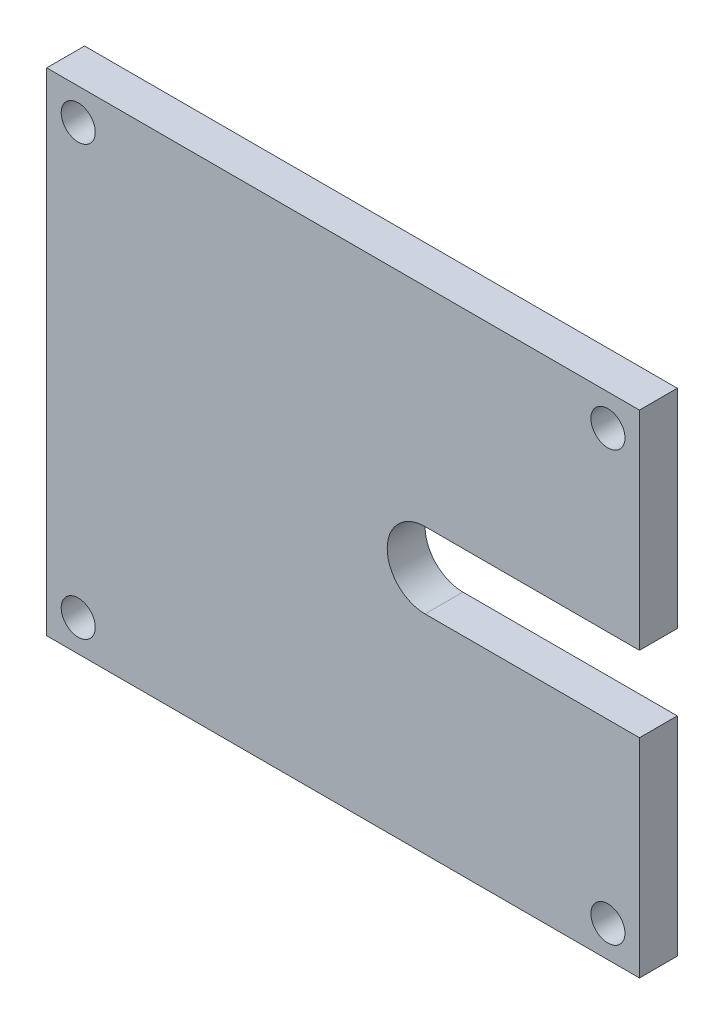
ISO-10303-21;
HEADER;
FILE_DESCRIPTION(('STEP AP214'),'2;1');
FILE_NAME('part.step','',(''),(''),'','','');
FILE_SCHEMA(('AUTOMOTIVE_DESIGN { 1 0 10303 214 1 1 1 1 }'));
ENDSEC;
DATA;
#1=APPLICATION_CONTEXT('core data for automotive mechanical design processes');
#2=APPLICATION_PROTOCOL_DEFINITION('international standard','automotive_design',2000,#1);
#3=PRODUCT_CONTEXT('',#1,'mechanical');
#4=PRODUCT('Part','Part','',(#3));
#5=PRODUCT_RELATED_PRODUCT_CATEGORY('part','',(#4));
#6=PRODUCT_DEFINITION_FORMATION('','',#4);
#7=PRODUCT_DEFINITION_CONTEXT('part definition',#1,'design');
#8=PRODUCT_DEFINITION('design','',#6,#7);
#9=PRODUCT_DEFINITION_SHAPE('','',#8);
#10=(LENGTH_UNIT() NAMED_UNIT(*) SI_UNIT(.MILLI.,.METRE.));
#11=(NAMED_UNIT(*) PLANE_ANGLE_UNIT() SI_UNIT($,.RADIAN.));
#12=(NAMED_UNIT(*) SI_UNIT($,.STERADIAN.) SOLID_ANGLE_UNIT());
#13=UNCERTAINTY_MEASURE_WITH_UNIT(LENGTH_MEASURE(1.E-05),#10,'distance_accuracy_value','');
#14=(GEOMETRIC_REPRESENTATION_CONTEXT(3) GLOBAL_UNCERTAINTY_ASSIGNED_CONTEXT((#13)) GLOBAL_UNIT_ASSIGNED_CONTEXT((#10,
#11,#12)) REPRESENTATION_CONTEXT('',''));
#15=CARTESIAN_POINT('',(0.,0.,0.));
#16=DIRECTION('',(0.,0.,1.));
#17=DIRECTION('',(1.,0.,0.));
#18=AXIS2_PLACEMENT_3D('',#15,#16,#17);
#19=CARTESIAN_POINT('',(23.5,-19.5,3.));
#20=DIRECTION('',(-1.,0.,0.));
#21=DIRECTION('',(0.,0.,1.));
#22=AXIS2_PLACEMENT_3D('',#19,#20,#21);
#23=PLANE('',#22);
#24=DIRECTION('',(0.,1.,0.));
#25=VECTOR('',#24,1.);
#26=CARTESIAN_POINT('',(23.5,-19.5,3.));
#27=LINE('',#26,#25);
#28=CARTESIAN_POINT('',(23.5,3.,3.));
#29=VERTEX_POINT('',#28);
#30=CARTESIAN_POINT('',(23.5,19.5,3.));
#31=VERTEX_POINT('',#30);
#32=EDGE_CURVE('E96',#29,#31,#27,.T.);
#33=ORIENTED_EDGE('',*,*,#32,.F.);
#34=DIRECTION('',(0.,0.,1.));
#35=VECTOR('',#34,1.);
#36=CARTESIAN_POINT('',(23.5,3.,-0.001000000000001));
#37=LINE('',#36,#35);
#38=CARTESIAN_POINT('',(23.5,3.,0.));
#39=VERTEX_POINT('',#38);
#40=EDGE_CURVE('E139',#39,#29,#37,.T.);
#41=ORIENTED_EDGE('',*,*,#40,.F.);
#42=DIRECTION('',(0.,1.,0.));
#43=VECTOR('',#42,1.);
#44=CARTESIAN_POINT('',(23.5,-19.5,0.));
#45=LINE('',#44,#43);
#46=CARTESIAN_POINT('',(23.5,19.5,0.));
#47=VERTEX_POINT('',#46);
#48=EDGE_CURVE('E162',#39,#47,#45,.T.);
#49=ORIENTED_EDGE('',*,*,#48,.T.);
#50=DIRECTION('',(0.,0.,-1.));
#51=VECTOR('',#50,1.);
#52=CARTESIAN_POINT('',(23.5,19.5,3.));
#53=LINE('',#52,#51);
#54=EDGE_CURVE('E11',#31,#47,#53,.T.);
#55=ORIENTED_EDGE('',*,*,#54,.F.);
#56=EDGE_LOOP('',(#33,#41,#49,#55));
#57=FACE_BOUND('',#56,.T.);
#58=ADVANCED_FACE('F40',(#57),#23,.F.);
#59=CARTESIAN_POINT('',(23.5,-19.5,0.));
#60=VERTEX_POINT('',#59);
#61=CARTESIAN_POINT('',(23.5,-3.,0.));
#62=VERTEX_POINT('',#61);
#63=EDGE_CURVE('E137',#60,#62,#45,.T.);
#64=ORIENTED_EDGE('',*,*,#63,.T.);
#65=DIRECTION('',(0.,0.,-1.));
#66=VECTOR('',#65,1.);
#67=CARTESIAN_POINT('',(23.5,-3.,-0.001000000000001));
#68=LINE('',#67,#66);
#69=CARTESIAN_POINT('',(23.5,-3.,3.));
#70=VERTEX_POINT('',#69);
#71=EDGE_CURVE('E57',#70,#62,#68,.T.);
#72=ORIENTED_EDGE('',*,*,#71,.F.);
#73=CARTESIAN_POINT('',(23.5,-19.5,3.));
#74=VERTEX_POINT('',#73);
#75=EDGE_CURVE('E135',#74,#70,#27,.T.);
#76=ORIENTED_EDGE('',*,*,#75,.F.);
#77=DIRECTION('',(0.,0.,-1.));
#78=VECTOR('',#77,1.);
#79=CARTESIAN_POINT('',(23.5,-19.5,3.));
#80=LINE('',#79,#78);
#81=EDGE_CURVE('E158',#74,#60,#80,.T.);
#82=ORIENTED_EDGE('',*,*,#81,.T.);
#83=EDGE_LOOP('',(#64,#72,#76,#82));
#84=FACE_BOUND('',#83,.T.);
#85=ADVANCED_FACE('F42',(#84),#23,.F.);
#86=CARTESIAN_POINT('',(-23.5,19.5,3.));
#87=DIRECTION('',(0.,-1.,0.));
#88=DIRECTION('',(0.,0.,-1.));
#89=AXIS2_PLACEMENT_3D('',#86,#87,#88);
#90=PLANE('',#89);
#91=DIRECTION('',(-1.,0.,0.));
#92=VECTOR('',#91,1.);
#93=CARTESIAN_POINT('',(-23.5,19.5,0.));
#94=LINE('',#93,#92);
#95=CARTESIAN_POINT('',(-23.5,19.5,0.));
#96=VERTEX_POINT('',#95);
#97=EDGE_CURVE('E161',#47,#96,#94,.T.);
#98=ORIENTED_EDGE('',*,*,#97,.T.);
#99=DIRECTION('',(0.,0.,-1.));
#100=VECTOR('',#99,1.);
#101=CARTESIAN_POINT('',(-23.5,19.5,3.));
#102=LINE('',#101,#100);
#103=CARTESIAN_POINT('',(-23.5,19.5,3.));
#104=VERTEX_POINT('',#103);
#105=EDGE_CURVE('E48',#104,#96,#102,.T.);
#106=ORIENTED_EDGE('',*,*,#105,.F.);
#107=DIRECTION('',(-1.,0.,0.));
#108=VECTOR('',#107,1.);
#109=CARTESIAN_POINT('',(-23.5,19.5,3.));
#110=LINE('',#109,#108);
#111=EDGE_CURVE('E143',#31,#104,#110,.T.);
#112=ORIENTED_EDGE('',*,*,#111,.F.);
#113=ORIENTED_EDGE('',*,*,#54,.T.);
#114=EDGE_LOOP('',(#98,#106,#112,#113));
#115=FACE_BOUND('',#114,.T.);
#116=ADVANCED_FACE('F262',(#115),#90,.F.);
#117=CARTESIAN_POINT('',(-23.5,-19.5,3.));
#118=DIRECTION('',(1.,0.,0.));
#119=DIRECTION('',(0.,0.,-1.));
#120=AXIS2_PLACEMENT_3D('',#117,#118,#119);
#121=PLANE('',#120);
#122=DIRECTION('',(0.,-1.,0.));
#123=VECTOR('',#122,1.);
#124=CARTESIAN_POINT('',(-23.5,-19.5,0.));
#125=LINE('',#124,#123);
#126=CARTESIAN_POINT('',(-23.5,-19.5,0.));
#127=VERTEX_POINT('',#126);
#128=EDGE_CURVE('E165',#96,#127,#125,.T.);
#129=ORIENTED_EDGE('',*,*,#128,.T.);
#130=DIRECTION('',(0.,0.,-1.));
#131=VECTOR('',#130,1.);
#132=CARTESIAN_POINT('',(-23.5,-19.5,3.));
#133=LINE('',#132,#131);
#134=CARTESIAN_POINT('',(-23.5,-19.5,3.));
#135=VERTEX_POINT('',#134);
#136=EDGE_CURVE('E172',#135,#127,#133,.T.);
#137=ORIENTED_EDGE('',*,*,#136,.F.);
#138=DIRECTION('',(0.,-1.,0.));
#139=VECTOR('',#138,1.);
#140=CARTESIAN_POINT('',(-23.5,-19.5,3.));
#141=LINE('',#140,#139);
#142=EDGE_CURVE('E148',#104,#135,#141,.T.);
#143=ORIENTED_EDGE('',*,*,#142,.F.);
#144=ORIENTED_EDGE('',*,*,#105,.T.);
#145=EDGE_LOOP('',(#129,#137,#143,#144));
#146=FACE_BOUND('',#145,.T.);
#147=ADVANCED_FACE('F180',(#146),#121,.F.);
#148=CARTESIAN_POINT('',(-23.5,-19.5,3.));
#149=DIRECTION('',(0.,1.,0.));
#150=DIRECTION('',(0.,0.,1.));
#151=AXIS2_PLACEMENT_3D('',#148,#149,#150);
#152=PLANE('',#151);
#153=DIRECTION('',(1.,0.,0.));
#154=VECTOR('',#153,1.);
#155=CARTESIAN_POINT('',(-23.5,-19.5,0.));
#156=LINE('',#155,#154);
#157=EDGE_CURVE('E89',#127,#60,#156,.T.);
#158=ORIENTED_EDGE('',*,*,#157,.T.);
#159=ORIENTED_EDGE('',*,*,#81,.F.);
#160=DIRECTION('',(1.,0.,0.));
#161=VECTOR('',#160,1.);
#162=CARTESIAN_POINT('',(-23.5,-19.5,3.));
#163=LINE('',#162,#161);
#164=EDGE_CURVE('E68',#135,#74,#163,.T.);
#165=ORIENTED_EDGE('',*,*,#164,.F.);
#166=ORIENTED_EDGE('',*,*,#136,.T.);
#167=EDGE_LOOP('',(#158,#159,#165,#166));
#168=FACE_BOUND('',#167,.T.);
#169=ADVANCED_FACE('F269',(#168),#152,.F.);
#170=CARTESIAN_POINT('',(0.,0.,3.));
#171=DIRECTION('',(0.,0.,-1.));
#172=DIRECTION('',(-1.,0.,0.));
#173=AXIS2_PLACEMENT_3D('',#170,#171,#172);
#174=PLANE('',#173);
#175=CARTESIAN_POINT('',(-21.,-17.,3.));
#176=DIRECTION('',(0.,0.,1.));
#177=DIRECTION('',(1.,0.,0.));
#178=AXIS2_PLACEMENT_3D('',#175,#176,#177);
#179=CIRCLE('',#178,1.35);
#180=CARTESIAN_POINT('',(-19.65,-17.,3.));
#181=VERTEX_POINT('',#180);
#182=EDGE_CURVE('E194',#181,#181,#179,.T.);
#183=ORIENTED_EDGE('',*,*,#182,.F.);
#184=EDGE_LOOP('',(#183));
#185=FACE_BOUND('',#184,.T.);
#186=CARTESIAN_POINT('',(21.,17.,3.));
#187=DIRECTION('',(0.,0.,1.));
#188=DIRECTION('',(1.,0.,0.));
#189=AXIS2_PLACEMENT_3D('',#186,#187,#188);
#190=CIRCLE('',#189,1.35);
#191=CARTESIAN_POINT('',(22.35,17.,3.));
#192=VERTEX_POINT('',#191);
#193=EDGE_CURVE('E206',#192,#192,#190,.T.);
#194=ORIENTED_EDGE('',*,*,#193,.F.);
#195=EDGE_LOOP('',(#194));
#196=FACE_BOUND('',#195,.T.);
#197=CARTESIAN_POINT('',(21.,-17.,3.));
#198=DIRECTION('',(0.,0.,1.));
#199=DIRECTION('',(1.,0.,0.));
#200=AXIS2_PLACEMENT_3D('',#197,#198,#199);
#201=CIRCLE('',#200,1.35);
#202=CARTESIAN_POINT('',(22.35,-17.,3.));
#203=VERTEX_POINT('',#202);
#204=EDGE_CURVE('E212',#203,#203,#201,.T.);
#205=ORIENTED_EDGE('',*,*,#204,.F.);
#206=EDGE_LOOP('',(#205));
#207=FACE_BOUND('',#206,.T.);
#208=CARTESIAN_POINT('',(-21.,17.,3.));
#209=DIRECTION('',(0.,0.,1.));
#210=DIRECTION('',(1.,0.,0.));
#211=AXIS2_PLACEMENT_3D('',#208,#209,#210);
#212=CIRCLE('',#211,1.35);
#213=CARTESIAN_POINT('',(-19.65,17.,3.));
#214=VERTEX_POINT('',#213);
#215=EDGE_CURVE('E217',#214,#214,#212,.T.);
#216=ORIENTED_EDGE('',*,*,#215,.F.);
#217=EDGE_LOOP('',(#216));
#218=FACE_BOUND('',#217,.T.);
#219=CARTESIAN_POINT('',(6.5,0.,3.));
#220=DIRECTION('',(0.,0.,1.));
#221=DIRECTION('',(1.,0.,0.));
#222=AXIS2_PLACEMENT_3D('',#219,#220,#221);
#223=CIRCLE('',#222,3.);
#224=CARTESIAN_POINT('',(6.5,3.,3.));
#225=VERTEX_POINT('',#224);
#226=CARTESIAN_POINT('',(6.5,-3.,3.));
#227=VERTEX_POINT('',#226);
#228=EDGE_CURVE('E130',#225,#227,#223,.T.);
#229=ORIENTED_EDGE('',*,*,#228,.F.);
#230=DIRECTION('',(-1.,0.,0.));
#231=VECTOR('',#230,1.);
#232=CARTESIAN_POINT('',(6.5,3.,3.));
#233=LINE('',#232,#231);
#234=EDGE_CURVE('E129',#29,#225,#233,.T.);
#235=ORIENTED_EDGE('',*,*,#234,.F.);
#236=ORIENTED_EDGE('',*,*,#32,.T.);
#237=ORIENTED_EDGE('',*,*,#111,.T.);
#238=ORIENTED_EDGE('',*,*,#142,.T.);
#239=ORIENTED_EDGE('',*,*,#164,.T.);
#240=ORIENTED_EDGE('',*,*,#75,.T.);
#241=DIRECTION('',(1.,0.,0.));
#242=VECTOR('',#241,1.);
#243=CARTESIAN_POINT('',(6.5,-3.,3.));
#244=LINE('',#243,#242);
#245=EDGE_CURVE('E123',#227,#70,#244,.T.);
#246=ORIENTED_EDGE('',*,*,#245,.F.);
#247=EDGE_LOOP('',(#229,#235,#236,#237,#238,#239,#240,#246));
#248=FACE_BOUND('',#247,.T.);
#249=ADVANCED_FACE('F141',(#185,#196,#207,#218,#248),#174,.F.);
#250=CARTESIAN_POINT('',(0.,0.,0.));
#251=DIRECTION('',(0.,0.,-1.));
#252=DIRECTION('',(-1.,0.,0.));
#253=AXIS2_PLACEMENT_3D('',#250,#251,#252);
#254=PLANE('',#253);
#255=DIRECTION('',(-1.,0.,0.));
#256=VECTOR('',#255,1.);
#257=CARTESIAN_POINT('',(6.5,3.,0.));
#258=LINE('',#257,#256);
#259=CARTESIAN_POINT('',(6.5,3.,0.));
#260=VERTEX_POINT('',#259);
#261=EDGE_CURVE('E230',#39,#260,#258,.T.);
#262=ORIENTED_EDGE('',*,*,#261,.T.);
#263=CARTESIAN_POINT('',(6.5,0.,0.));
#264=DIRECTION('',(0.,0.,-1.));
#265=DIRECTION('',(-1.,0.,0.));
#266=AXIS2_PLACEMENT_3D('',#263,#264,#265);
#267=CIRCLE('',#266,3.);
#268=CARTESIAN_POINT('',(6.5,-3.,0.));
#269=VERTEX_POINT('',#268);
#270=EDGE_CURVE('E192',#260,#269,#267,.F.);
#271=ORIENTED_EDGE('',*,*,#270,.T.);
#272=DIRECTION('',(1.,0.,0.));
#273=VECTOR('',#272,1.);
#274=CARTESIAN_POINT('',(6.5,-3.,0.));
#275=LINE('',#274,#273);
#276=EDGE_CURVE('E190',#269,#62,#275,.T.);
#277=ORIENTED_EDGE('',*,*,#276,.T.);
#278=ORIENTED_EDGE('',*,*,#63,.F.);
#279=ORIENTED_EDGE('',*,*,#157,.F.);
#280=ORIENTED_EDGE('',*,*,#128,.F.);
#281=ORIENTED_EDGE('',*,*,#97,.F.);
#282=ORIENTED_EDGE('',*,*,#48,.F.);
#283=EDGE_LOOP('',(#262,#271,#277,#278,#279,#280,#281,#282));
#284=FACE_BOUND('',#283,.T.);
#285=CARTESIAN_POINT('',(-21.,-17.,0.));
#286=DIRECTION('',(0.,0.,-1.));
#287=DIRECTION('',(-1.,0.,0.));
#288=AXIS2_PLACEMENT_3D('',#285,#286,#287);
#289=CIRCLE('',#288,1.35);
#290=CARTESIAN_POINT('',(-22.35,-17.,0.));
#291=VERTEX_POINT('',#290);
#292=EDGE_CURVE('E199',#291,#291,#289,.T.);
#293=ORIENTED_EDGE('',*,*,#292,.F.);
#294=EDGE_LOOP('',(#293));
#295=FACE_BOUND('',#294,.T.);
#296=CARTESIAN_POINT('',(21.,17.,0.));
#297=DIRECTION('',(0.,0.,-1.));
#298=DIRECTION('',(-1.,0.,0.));
#299=AXIS2_PLACEMENT_3D('',#296,#297,#298);
#300=CIRCLE('',#299,1.35);
#301=CARTESIAN_POINT('',(19.65,17.,0.));
#302=VERTEX_POINT('',#301);
#303=EDGE_CURVE('E209',#302,#302,#300,.T.);
#304=ORIENTED_EDGE('',*,*,#303,.F.);
#305=EDGE_LOOP('',(#304));
#306=FACE_BOUND('',#305,.T.);
#307=CARTESIAN_POINT('',(21.,-17.,0.));
#308=DIRECTION('',(0.,0.,-1.));
#309=DIRECTION('',(-1.,0.,0.));
#310=AXIS2_PLACEMENT_3D('',#307,#308,#309);
#311=CIRCLE('',#310,1.35);
#312=CARTESIAN_POINT('',(19.65,-17.,0.));
#313=VERTEX_POINT('',#312);
#314=EDGE_CURVE('E215',#313,#313,#311,.T.);
#315=ORIENTED_EDGE('',*,*,#314,.F.);
#316=EDGE_LOOP('',(#315));
#317=FACE_BOUND('',#316,.T.);
#318=CARTESIAN_POINT('',(-21.,17.,0.));
#319=DIRECTION('',(0.,0.,-1.));
#320=DIRECTION('',(-1.,0.,0.));
#321=AXIS2_PLACEMENT_3D('',#318,#319,#320);
#322=CIRCLE('',#321,1.35);
#323=CARTESIAN_POINT('',(-22.35,17.,0.));
#324=VERTEX_POINT('',#323);
#325=EDGE_CURVE('E152',#324,#324,#322,.T.);
#326=ORIENTED_EDGE('',*,*,#325,.F.);
#327=EDGE_LOOP('',(#326));
#328=FACE_BOUND('',#327,.T.);
#329=ADVANCED_FACE('F186',(#284,#295,#306,#317,#328),#254,.T.);
#330=CARTESIAN_POINT('',(-21.,17.,3.));
#331=DIRECTION('',(0.,0.,1.));
#332=DIRECTION('',(1.,0.,0.));
#333=AXIS2_PLACEMENT_3D('',#330,#331,#332);
#334=CYLINDRICAL_SURFACE('',#333,1.35);
#335=ORIENTED_EDGE('',*,*,#215,.T.);
#336=EDGE_LOOP('',(#335));
#337=FACE_BOUND('',#336,.T.);
#338=ORIENTED_EDGE('',*,*,#325,.T.);
#339=EDGE_LOOP('',(#338));
#340=FACE_BOUND('',#339,.T.);
#341=ADVANCED_FACE('F276',(#337,#340),#334,.F.);
#342=CARTESIAN_POINT('',(21.,-17.,3.));
#343=DIRECTION('',(0.,0.,1.));
#344=DIRECTION('',(1.,0.,0.));
#345=AXIS2_PLACEMENT_3D('',#342,#343,#344);
#346=CYLINDRICAL_SURFACE('',#345,1.35);
#347=ORIENTED_EDGE('',*,*,#204,.T.);
#348=EDGE_LOOP('',(#347));
#349=FACE_BOUND('',#348,.T.);
#350=ORIENTED_EDGE('',*,*,#314,.T.);
#351=EDGE_LOOP('',(#350));
#352=FACE_BOUND('',#351,.T.);
#353=ADVANCED_FACE('F282',(#349,#352),#346,.F.);
#354=CARTESIAN_POINT('',(21.,17.,3.));
#355=DIRECTION('',(0.,0.,1.));
#356=DIRECTION('',(1.,0.,0.));
#357=AXIS2_PLACEMENT_3D('',#354,#355,#356);
#358=CYLINDRICAL_SURFACE('',#357,1.35);
#359=ORIENTED_EDGE('',*,*,#193,.T.);
#360=EDGE_LOOP('',(#359));
#361=FACE_BOUND('',#360,.T.);
#362=ORIENTED_EDGE('',*,*,#303,.T.);
#363=EDGE_LOOP('',(#362));
#364=FACE_BOUND('',#363,.T.);
#365=ADVANCED_FACE('F254',(#361,#364),#358,.F.);
#366=CARTESIAN_POINT('',(-21.,-17.,3.));
#367=DIRECTION('',(0.,0.,1.));
#368=DIRECTION('',(1.,0.,0.));
#369=AXIS2_PLACEMENT_3D('',#366,#367,#368);
#370=CYLINDRICAL_SURFACE('',#369,1.35);
#371=ORIENTED_EDGE('',*,*,#182,.T.);
#372=EDGE_LOOP('',(#371));
#373=FACE_BOUND('',#372,.T.);
#374=ORIENTED_EDGE('',*,*,#292,.T.);
#375=EDGE_LOOP('',(#374));
#376=FACE_BOUND('',#375,.T.);
#377=ADVANCED_FACE('F247',(#373,#376),#370,.F.);
#378=CARTESIAN_POINT('',(6.5,0.,-0.001000000000001));
#379=DIRECTION('',(0.,0.,1.));
#380=DIRECTION('',(1.,0.,0.));
#381=AXIS2_PLACEMENT_3D('',#378,#379,#380);
#382=CYLINDRICAL_SURFACE('',#381,3.);
#383=DIRECTION('',(0.,0.,1.));
#384=VECTOR('',#383,1.);
#385=CARTESIAN_POINT('',(6.5,3.,-0.001000000000001));
#386=LINE('',#385,#384);
#387=EDGE_CURVE('E195',#260,#225,#386,.T.);
#388=ORIENTED_EDGE('',*,*,#387,.T.);
#389=ORIENTED_EDGE('',*,*,#228,.T.);
#390=DIRECTION('',(0.,0.,1.));
#391=VECTOR('',#390,1.);
#392=CARTESIAN_POINT('',(6.5,-3.,-0.001000000000001));
#393=LINE('',#392,#391);
#394=EDGE_CURVE('E125',#269,#227,#393,.T.);
#395=ORIENTED_EDGE('',*,*,#394,.F.);
#396=ORIENTED_EDGE('',*,*,#270,.F.);
#397=EDGE_LOOP('',(#388,#389,#395,#396));
#398=FACE_BOUND('',#397,.T.);
#399=ADVANCED_FACE('F245',(#398),#382,.F.);
#400=CARTESIAN_POINT('',(6.5,3.,-0.001000000000001));
#401=DIRECTION('',(0.,1.,0.));
#402=DIRECTION('',(-1.,0.,0.));
#403=AXIS2_PLACEMENT_3D('',#400,#401,#402);
#404=PLANE('',#403);
#405=ORIENTED_EDGE('',*,*,#40,.T.);
#406=ORIENTED_EDGE('',*,*,#234,.T.);
#407=ORIENTED_EDGE('',*,*,#387,.F.);
#408=ORIENTED_EDGE('',*,*,#261,.F.);
#409=EDGE_LOOP('',(#405,#406,#407,#408));
#410=FACE_BOUND('',#409,.T.);
#411=ADVANCED_FACE('F243',(#410),#404,.F.);
#412=CARTESIAN_POINT('',(6.5,-3.,-0.001000000000001));
#413=DIRECTION('',(0.,-1.,0.));
#414=DIRECTION('',(1.,0.,0.));
#415=AXIS2_PLACEMENT_3D('',#412,#413,#414);
#416=PLANE('',#415);
#417=ORIENTED_EDGE('',*,*,#394,.T.);
#418=ORIENTED_EDGE('',*,*,#245,.T.);
#419=ORIENTED_EDGE('',*,*,#71,.T.);
#420=ORIENTED_EDGE('',*,*,#276,.F.);
#421=EDGE_LOOP('',(#417,#418,#419,#420));
#422=FACE_BOUND('',#421,.T.);
#423=ADVANCED_FACE('F124',(#422),#416,.F.);
#424=CLOSED_SHELL('',(#58,#85,#116,#147,#169,#249,#329,#341,#353,#365,#377,#399,#411,#423));
#425=MANIFOLD_SOLID_BREP('B2',#424);
#426=ADVANCED_BREP_SHAPE_REPRESENTATION('',(#18,#425),#14);
#427=SHAPE_DEFINITION_REPRESENTATION(#9,#426);
ENDSEC;
END-ISO-10303-21;
